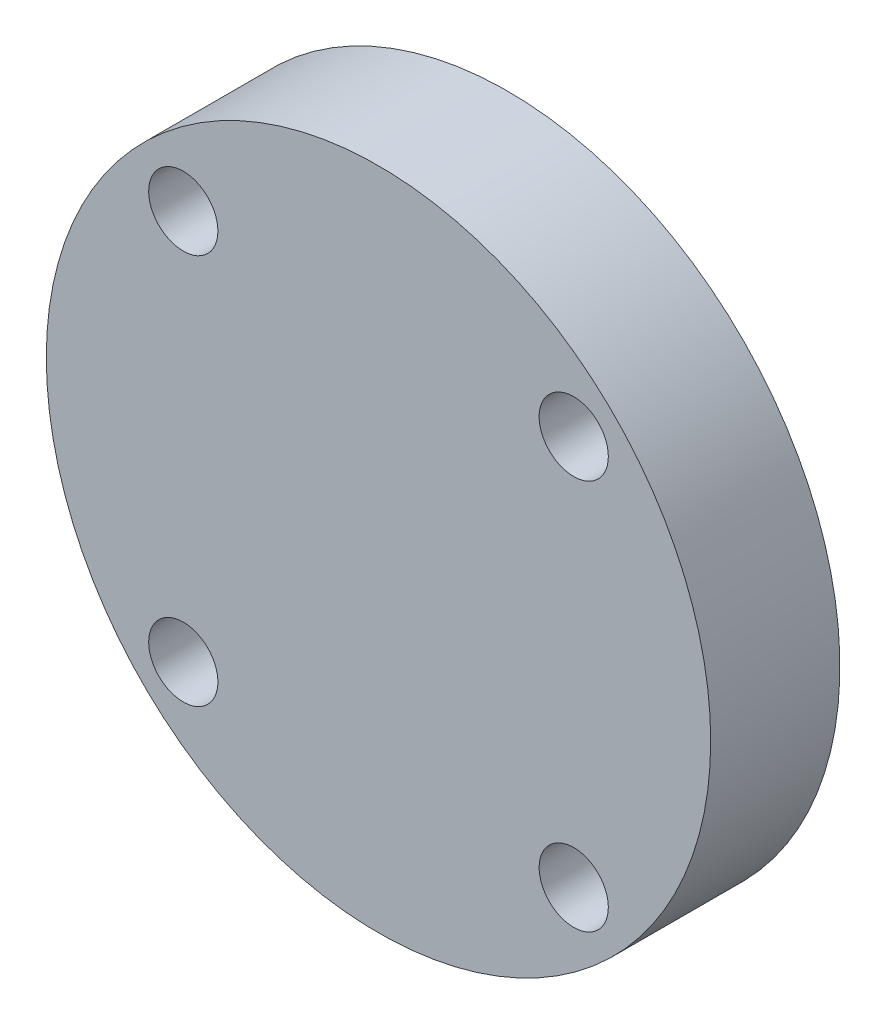
ISO-10303-21;
HEADER;
FILE_DESCRIPTION(('STEP AP214'),'2;1');
FILE_NAME('part.step','',(''),(''),'','','');
FILE_SCHEMA(('AUTOMOTIVE_DESIGN { 1 0 10303 214 1 1 1 1 }'));
ENDSEC;
DATA;
#1=APPLICATION_CONTEXT('core data for automotive mechanical design processes');
#2=APPLICATION_PROTOCOL_DEFINITION('international standard','automotive_design',2000,#1);
#3=PRODUCT_CONTEXT('',#1,'mechanical');
#4=PRODUCT('Part','Part','',(#3));
#5=PRODUCT_RELATED_PRODUCT_CATEGORY('part','',(#4));
#6=PRODUCT_DEFINITION_FORMATION('','',#4);
#7=PRODUCT_DEFINITION_CONTEXT('part definition',#1,'design');
#8=PRODUCT_DEFINITION('design','',#6,#7);
#9=PRODUCT_DEFINITION_SHAPE('','',#8);
#10=(LENGTH_UNIT() NAMED_UNIT(*) SI_UNIT(.MILLI.,.METRE.));
#11=(NAMED_UNIT(*) PLANE_ANGLE_UNIT() SI_UNIT($,.RADIAN.));
#12=(NAMED_UNIT(*) SI_UNIT($,.STERADIAN.) SOLID_ANGLE_UNIT());
#13=UNCERTAINTY_MEASURE_WITH_UNIT(LENGTH_MEASURE(1.E-05),#10,'distance_accuracy_value','');
#14=(GEOMETRIC_REPRESENTATION_CONTEXT(3) GLOBAL_UNCERTAINTY_ASSIGNED_CONTEXT((#13)) GLOBAL_UNIT_ASSIGNED_CONTEXT((#10,
#11,#12)) REPRESENTATION_CONTEXT('',''));
#15=CARTESIAN_POINT('',(0.,0.,0.));
#16=DIRECTION('',(0.,0.,1.));
#17=DIRECTION('',(1.,0.,0.));
#18=AXIS2_PLACEMENT_3D('',#15,#16,#17);
#19=CARTESIAN_POINT('',(0.,0.,25.4));
#20=DIRECTION('',(0.,0.,-1.));
#21=DIRECTION('',(-1.,0.,0.));
#22=AXIS2_PLACEMENT_3D('',#19,#20,#21);
#23=CYLINDRICAL_SURFACE('',#22,114.3);
#24=CARTESIAN_POINT('',(0.,0.,25.4));
#25=DIRECTION('',(0.,0.,1.));
#26=DIRECTION('',(1.,0.,0.));
#27=AXIS2_PLACEMENT_3D('',#24,#25,#26);
#28=CIRCLE('',#27,114.3);
#29=CARTESIAN_POINT('',(114.3,0.,25.4));
#30=VERTEX_POINT('',#29);
#31=EDGE_CURVE('E10',#30,#30,#28,.T.);
#32=ORIENTED_EDGE('',*,*,#31,.F.);
#33=EDGE_LOOP('',(#32));
#34=FACE_BOUND('',#33,.T.);
#35=CARTESIAN_POINT('',(0.,0.,-19.05));
#36=DIRECTION('',(0.,0.,-1.));
#37=DIRECTION('',(-1.,0.,0.));
#38=AXIS2_PLACEMENT_3D('',#35,#36,#37);
#39=CIRCLE('',#38,114.3);
#40=CARTESIAN_POINT('',(-114.3,0.,-19.05));
#41=VERTEX_POINT('',#40);
#42=EDGE_CURVE('E38',#41,#41,#39,.T.);
#43=ORIENTED_EDGE('',*,*,#42,.F.);
#44=EDGE_LOOP('',(#43));
#45=FACE_BOUND('',#44,.T.);
#46=ADVANCED_FACE('F32',(#34,#45),#23,.T.);
#47=CARTESIAN_POINT('',(0.,0.,25.4));
#48=DIRECTION('',(0.,0.,1.));
#49=DIRECTION('',(1.,0.,0.));
#50=AXIS2_PLACEMENT_3D('',#47,#48,#49);
#51=PLANE('',#50);
#52=CARTESIAN_POINT('',(67.1723157855969,-67.1723157855976,25.4));
#53=DIRECTION('',(0.,0.,1.));
#54=DIRECTION('',(0.,-1.,0.));
#55=AXIS2_PLACEMENT_3D('',#52,#53,#54);
#56=CIRCLE('',#55,11.90625);
#57=CARTESIAN_POINT('',(67.1723157855969,-79.0785657855976,25.4));
#58=VERTEX_POINT('',#57);
#59=EDGE_CURVE('E67',#58,#58,#56,.T.);
#60=ORIENTED_EDGE('',*,*,#59,.F.);
#61=EDGE_LOOP('',(#60));
#62=FACE_BOUND('',#61,.T.);
#63=CARTESIAN_POINT('',(-67.1723157855974,-67.1723157855971,25.4));
#64=DIRECTION('',(0.,0.,1.));
#65=DIRECTION('',(-1.,0.,0.));
#66=AXIS2_PLACEMENT_3D('',#63,#64,#65);
#67=CIRCLE('',#66,11.90625);
#68=CARTESIAN_POINT('',(-79.0785657855974,-67.1723157855971,25.4));
#69=VERTEX_POINT('',#68);
#70=EDGE_CURVE('E77',#69,#69,#67,.T.);
#71=ORIENTED_EDGE('',*,*,#70,.F.);
#72=EDGE_LOOP('',(#71));
#73=FACE_BOUND('',#72,.T.);
#74=CARTESIAN_POINT('',(-67.1723157855964,67.1723157855981,25.4));
#75=DIRECTION('',(0.,0.,1.));
#76=DIRECTION('',(0.,1.,0.));
#77=AXIS2_PLACEMENT_3D('',#74,#75,#76);
#78=CIRCLE('',#77,11.90625);
#79=CARTESIAN_POINT('',(-67.1723157855963,79.0785657855981,25.4));
#80=VERTEX_POINT('',#79);
#81=EDGE_CURVE('E70',#80,#80,#78,.T.);
#82=ORIENTED_EDGE('',*,*,#81,.F.);
#83=EDGE_LOOP('',(#82));
#84=FACE_BOUND('',#83,.T.);
#85=CARTESIAN_POINT('',(67.1723157855974,67.1723157855971,25.4));
#86=DIRECTION('',(0.,0.,1.));
#87=DIRECTION('',(1.,0.,0.));
#88=AXIS2_PLACEMENT_3D('',#85,#86,#87);
#89=CIRCLE('',#88,11.90625);
#90=CARTESIAN_POINT('',(79.0785657855974,67.1723157855971,25.4));
#91=VERTEX_POINT('',#90);
#92=EDGE_CURVE('E61',#91,#91,#89,.T.);
#93=ORIENTED_EDGE('',*,*,#92,.F.);
#94=EDGE_LOOP('',(#93));
#95=FACE_BOUND('',#94,.T.);
#96=ORIENTED_EDGE('',*,*,#31,.T.);
#97=EDGE_LOOP('',(#96));
#98=FACE_BOUND('',#97,.T.);
#99=ADVANCED_FACE('F98',(#62,#73,#84,#95,#98),#51,.T.);
#100=CARTESIAN_POINT('',(0.,0.,-19.05));
#101=DIRECTION('',(0.,0.,-1.));
#102=DIRECTION('',(-1.,0.,0.));
#103=AXIS2_PLACEMENT_3D('',#100,#101,#102);
#104=PLANE('',#103);
#105=CARTESIAN_POINT('',(67.1723157855969,-67.1723157855976,-19.05));
#106=DIRECTION('',(0.,0.,-1.));
#107=DIRECTION('',(0.,1.,0.));
#108=AXIS2_PLACEMENT_3D('',#105,#106,#107);
#109=CIRCLE('',#108,11.90625);
#110=CARTESIAN_POINT('',(67.172315785597,-55.2660657855976,-19.05));
#111=VERTEX_POINT('',#110);
#112=EDGE_CURVE('E80',#111,#111,#109,.F.);
#113=ORIENTED_EDGE('',*,*,#112,.T.);
#114=EDGE_LOOP('',(#113));
#115=FACE_BOUND('',#114,.T.);
#116=CARTESIAN_POINT('',(-67.1723157855974,-67.1723157855971,-19.05));
#117=DIRECTION('',(0.,0.,-1.));
#118=DIRECTION('',(1.,0.,0.));
#119=AXIS2_PLACEMENT_3D('',#116,#117,#118);
#120=CIRCLE('',#119,11.90625);
#121=CARTESIAN_POINT('',(-55.2660657855974,-67.1723157855971,-19.05));
#122=VERTEX_POINT('',#121);
#123=EDGE_CURVE('E73',#122,#122,#120,.F.);
#124=ORIENTED_EDGE('',*,*,#123,.T.);
#125=EDGE_LOOP('',(#124));
#126=FACE_BOUND('',#125,.T.);
#127=CARTESIAN_POINT('',(-67.1723157855964,67.1723157855981,-19.05));
#128=DIRECTION('',(0.,0.,-1.));
#129=DIRECTION('',(0.,-1.,0.));
#130=AXIS2_PLACEMENT_3D('',#127,#128,#129);
#131=CIRCLE('',#130,11.90625);
#132=CARTESIAN_POINT('',(-67.1723157855966,55.2660657855981,-19.05));
#133=VERTEX_POINT('',#132);
#134=EDGE_CURVE('E74',#133,#133,#131,.F.);
#135=ORIENTED_EDGE('',*,*,#134,.T.);
#136=EDGE_LOOP('',(#135));
#137=FACE_BOUND('',#136,.T.);
#138=CARTESIAN_POINT('',(67.1723157855974,67.1723157855971,-19.05));
#139=DIRECTION('',(0.,0.,-1.));
#140=DIRECTION('',(-1.,0.,0.));
#141=AXIS2_PLACEMENT_3D('',#138,#139,#140);
#142=CIRCLE('',#141,11.90625);
#143=CARTESIAN_POINT('',(55.2660657855974,67.1723157855971,-19.05));
#144=VERTEX_POINT('',#143);
#145=EDGE_CURVE('E64',#144,#144,#142,.F.);
#146=ORIENTED_EDGE('',*,*,#145,.T.);
#147=EDGE_LOOP('',(#146));
#148=FACE_BOUND('',#147,.T.);
#149=CARTESIAN_POINT('',(0.,0.,-19.05));
#150=DIRECTION('',(0.,0.,-1.));
#151=DIRECTION('',(-1.,0.,0.));
#152=AXIS2_PLACEMENT_3D('',#149,#150,#151);
#153=CIRCLE('',#152,77.9399);
#154=CARTESIAN_POINT('',(-77.9399,0.,-19.05));
#155=VERTEX_POINT('',#154);
#156=EDGE_CURVE('E52',#155,#155,#153,.T.);
#157=ORIENTED_EDGE('',*,*,#156,.F.);
#158=EDGE_LOOP('',(#157));
#159=FACE_BOUND('',#158,.T.);
#160=ORIENTED_EDGE('',*,*,#42,.T.);
#161=EDGE_LOOP('',(#160));
#162=FACE_BOUND('',#161,.T.);
#163=ADVANCED_FACE('F88',(#115,#126,#137,#148,#159,#162),#104,.T.);
#164=CARTESIAN_POINT('',(0.,0.,-16.4846));
#165=DIRECTION('',(0.,0.,-1.));
#166=DIRECTION('',(-1.,0.,0.));
#167=AXIS2_PLACEMENT_3D('',#164,#165,#166);
#168=CYLINDRICAL_SURFACE('',#167,77.9399);
#169=CARTESIAN_POINT('',(0.,0.,-16.4846));
#170=DIRECTION('',(0.,0.,-1.));
#171=DIRECTION('',(-1.,0.,0.));
#172=AXIS2_PLACEMENT_3D('',#169,#170,#171);
#173=CIRCLE('',#172,77.9399);
#174=CARTESIAN_POINT('',(-77.9399,0.,-16.4846));
#175=VERTEX_POINT('',#174);
#176=EDGE_CURVE('E50',#175,#175,#173,.T.);
#177=ORIENTED_EDGE('',*,*,#176,.F.);
#178=EDGE_LOOP('',(#177));
#179=FACE_BOUND('',#178,.T.);
#180=ORIENTED_EDGE('',*,*,#156,.T.);
#181=EDGE_LOOP('',(#180));
#182=FACE_BOUND('',#181,.T.);
#183=ADVANCED_FACE('F141',(#179,#182),#168,.F.);
#184=CARTESIAN_POINT('',(0.,0.,-16.4846));
#185=DIRECTION('',(0.,0.,-1.));
#186=DIRECTION('',(-1.,0.,0.));
#187=AXIS2_PLACEMENT_3D('',#184,#185,#186);
#188=PLANE('',#187);
#189=CARTESIAN_POINT('',(0.,0.,-16.4846));
#190=DIRECTION('',(0.,0.,-1.));
#191=DIRECTION('',(-1.,0.,0.));
#192=AXIS2_PLACEMENT_3D('',#189,#190,#191);
#193=CIRCLE('',#192,73.3679);
#194=CARTESIAN_POINT('',(-73.3679,0.,-16.4846));
#195=VERTEX_POINT('',#194);
#196=EDGE_CURVE('E55',#195,#195,#193,.T.);
#197=ORIENTED_EDGE('',*,*,#196,.F.);
#198=EDGE_LOOP('',(#197));
#199=FACE_BOUND('',#198,.T.);
#200=ORIENTED_EDGE('',*,*,#176,.T.);
#201=EDGE_LOOP('',(#200));
#202=FACE_BOUND('',#201,.T.);
#203=ADVANCED_FACE('F148',(#199,#202),#188,.T.);
#204=CARTESIAN_POINT('',(0.,0.,-16.4846));
#205=DIRECTION('',(0.,0.,-1.));
#206=DIRECTION('',(-1.,0.,0.));
#207=AXIS2_PLACEMENT_3D('',#204,#205,#206);
#208=CYLINDRICAL_SURFACE('',#207,73.3679);
#209=ORIENTED_EDGE('',*,*,#196,.T.);
#210=EDGE_LOOP('',(#209));
#211=FACE_BOUND('',#210,.T.);
#212=CARTESIAN_POINT('',(0.,0.,-19.05));
#213=DIRECTION('',(0.,0.,-1.));
#214=DIRECTION('',(-1.,0.,0.));
#215=AXIS2_PLACEMENT_3D('',#212,#213,#214);
#216=CIRCLE('',#215,73.3679);
#217=CARTESIAN_POINT('',(-73.3679,0.,-19.05));
#218=VERTEX_POINT('',#217);
#219=EDGE_CURVE('E58',#218,#218,#216,.T.);
#220=ORIENTED_EDGE('',*,*,#219,.F.);
#221=EDGE_LOOP('',(#220));
#222=FACE_BOUND('',#221,.T.);
#223=ADVANCED_FACE('F157',(#211,#222),#208,.T.);
#224=CARTESIAN_POINT('',(0.,0.,-25.4));
#225=DIRECTION('',(0.,0.,1.));
#226=DIRECTION('',(1.,0.,0.));
#227=AXIS2_PLACEMENT_3D('',#224,#225,#226);
#228=PLANE('',#227);
#229=CARTESIAN_POINT('',(0.,0.,-25.4));
#230=DIRECTION('',(0.,0.,-1.));
#231=DIRECTION('',(-1.,0.,0.));
#232=AXIS2_PLACEMENT_3D('',#229,#230,#231);
#233=CIRCLE('',#232,68.2498);
#234=CARTESIAN_POINT('',(-68.2498,0.,-25.4));
#235=VERTEX_POINT('',#234);
#236=EDGE_CURVE('E46',#235,#235,#233,.T.);
#237=ORIENTED_EDGE('',*,*,#236,.T.);
#238=EDGE_LOOP('',(#237));
#239=FACE_BOUND('',#238,.T.);
#240=ADVANCED_FACE('F165',(#239),#228,.F.);
#241=CARTESIAN_POINT('',(0.,0.,-19.05));
#242=DIRECTION('',(0.,0.,-1.));
#243=DIRECTION('',(-1.,0.,0.));
#244=AXIS2_PLACEMENT_3D('',#241,#242,#243);
#245=CYLINDRICAL_SURFACE('',#244,68.2498);
#246=CARTESIAN_POINT('',(0.,0.,-19.05));
#247=DIRECTION('',(0.,0.,-1.));
#248=DIRECTION('',(-1.,0.,0.));
#249=AXIS2_PLACEMENT_3D('',#246,#247,#248);
#250=CIRCLE('',#249,68.2498);
#251=CARTESIAN_POINT('',(-68.2498,0.,-19.05));
#252=VERTEX_POINT('',#251);
#253=EDGE_CURVE('E42',#252,#252,#250,.T.);
#254=ORIENTED_EDGE('',*,*,#253,.T.);
#255=EDGE_LOOP('',(#254));
#256=FACE_BOUND('',#255,.T.);
#257=ORIENTED_EDGE('',*,*,#236,.F.);
#258=EDGE_LOOP('',(#257));
#259=FACE_BOUND('',#258,.T.);
#260=ADVANCED_FACE('F120',(#256,#259),#245,.T.);
#261=ORIENTED_EDGE('',*,*,#253,.F.);
#262=EDGE_LOOP('',(#261));
#263=FACE_BOUND('',#262,.T.);
#264=ORIENTED_EDGE('',*,*,#219,.T.);
#265=EDGE_LOOP('',(#264));
#266=FACE_BOUND('',#265,.T.);
#267=ADVANCED_FACE('F111',(#263,#266),#104,.T.);
#268=CARTESIAN_POINT('',(67.1723157855974,67.1723157855971,-25.401));
#269=DIRECTION('',(0.,0.,1.));
#270=DIRECTION('',(1.,0.,0.));
#271=AXIS2_PLACEMENT_3D('',#268,#269,#270);
#272=CYLINDRICAL_SURFACE('',#271,11.90625);
#273=ORIENTED_EDGE('',*,*,#145,.F.);
#274=EDGE_LOOP('',(#273));
#275=FACE_BOUND('',#274,.T.);
#276=ORIENTED_EDGE('',*,*,#92,.T.);
#277=EDGE_LOOP('',(#276));
#278=FACE_BOUND('',#277,.T.);
#279=ADVANCED_FACE('F108',(#275,#278),#272,.F.);
#280=CARTESIAN_POINT('',(-67.1723157855964,67.1723157855981,-25.401));
#281=DIRECTION('',(0.,0.,1.));
#282=DIRECTION('',(0.,1.,0.));
#283=AXIS2_PLACEMENT_3D('',#280,#281,#282);
#284=CYLINDRICAL_SURFACE('',#283,11.90625);
#285=ORIENTED_EDGE('',*,*,#134,.F.);
#286=EDGE_LOOP('',(#285));
#287=FACE_BOUND('',#286,.T.);
#288=ORIENTED_EDGE('',*,*,#81,.T.);
#289=EDGE_LOOP('',(#288));
#290=FACE_BOUND('',#289,.T.);
#291=ADVANCED_FACE('F110',(#287,#290),#284,.F.);
#292=CARTESIAN_POINT('',(-67.1723157855974,-67.1723157855971,-25.401));
#293=DIRECTION('',(0.,0.,1.));
#294=DIRECTION('',(-1.,0.,0.));
#295=AXIS2_PLACEMENT_3D('',#292,#293,#294);
#296=CYLINDRICAL_SURFACE('',#295,11.90625);
#297=ORIENTED_EDGE('',*,*,#123,.F.);
#298=EDGE_LOOP('',(#297));
#299=FACE_BOUND('',#298,.T.);
#300=ORIENTED_EDGE('',*,*,#70,.T.);
#301=EDGE_LOOP('',(#300));
#302=FACE_BOUND('',#301,.T.);
#303=ADVANCED_FACE('F94',(#299,#302),#296,.F.);
#304=CARTESIAN_POINT('',(67.1723157855969,-67.1723157855976,-25.401));
#305=DIRECTION('',(0.,0.,1.));
#306=DIRECTION('',(0.,-1.,0.));
#307=AXIS2_PLACEMENT_3D('',#304,#305,#306);
#308=CYLINDRICAL_SURFACE('',#307,11.90625);
#309=ORIENTED_EDGE('',*,*,#112,.F.);
#310=EDGE_LOOP('',(#309));
#311=FACE_BOUND('',#310,.T.);
#312=ORIENTED_EDGE('',*,*,#59,.T.);
#313=EDGE_LOOP('',(#312));
#314=FACE_BOUND('',#313,.T.);
#315=ADVANCED_FACE('F91',(#311,#314),#308,.F.);
#316=CLOSED_SHELL('',(#46,#99,#163,#183,#203,#223,#240,#260,#267,#279,#291,#303,#315));
#317=MANIFOLD_SOLID_BREP('B2',#316);
#318=ADVANCED_BREP_SHAPE_REPRESENTATION('',(#18,#317),#14);
#319=SHAPE_DEFINITION_REPRESENTATION(#9,#318);
ENDSEC;
END-ISO-10303-21;
